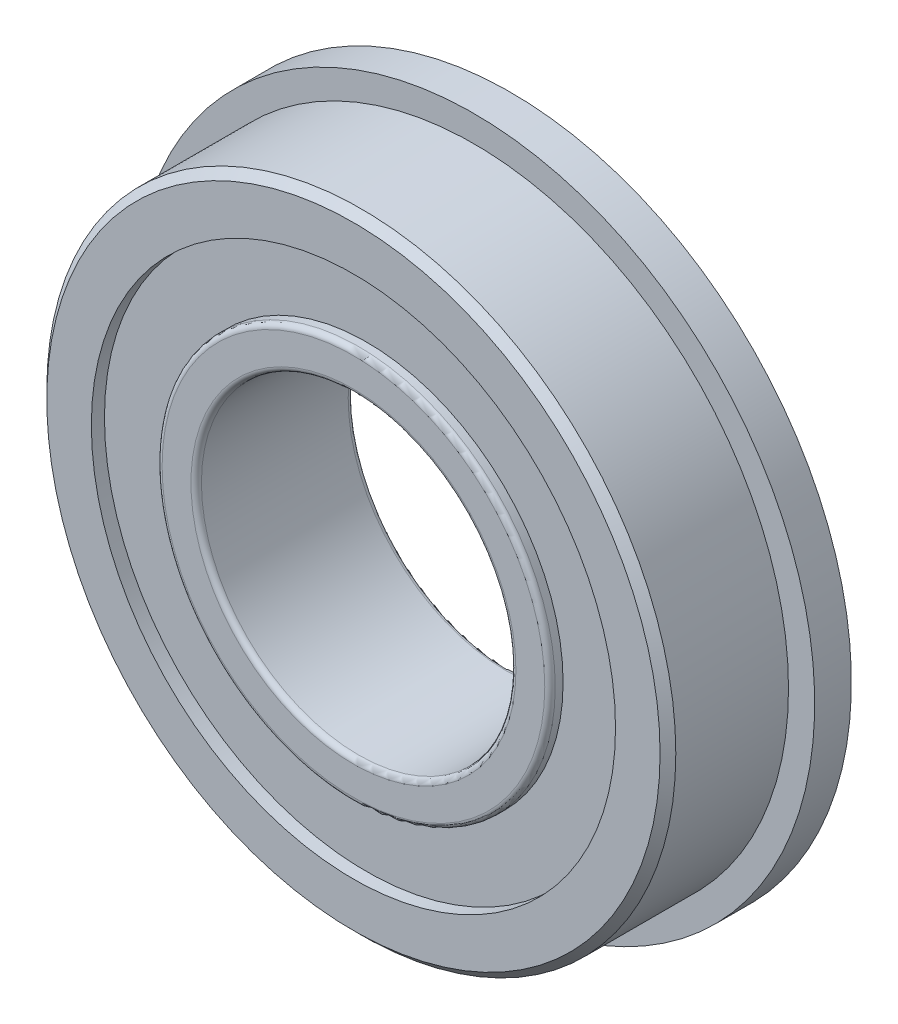
ISO-10303-21;
HEADER;
FILE_DESCRIPTION(('STEP AP214'),'2;1');
FILE_NAME('part.step','',(''),(''),'','','');
FILE_SCHEMA(('AUTOMOTIVE_DESIGN { 1 0 10303 214 1 1 1 1 }'));
ENDSEC;
DATA;
#1=APPLICATION_CONTEXT('core data for automotive mechanical design processes');
#2=APPLICATION_PROTOCOL_DEFINITION('international standard','automotive_design',2000,#1);
#3=PRODUCT_CONTEXT('',#1,'mechanical');
#4=PRODUCT('Part','Part','',(#3));
#5=PRODUCT_RELATED_PRODUCT_CATEGORY('part','',(#4));
#6=PRODUCT_DEFINITION_FORMATION('','',#4);
#7=PRODUCT_DEFINITION_CONTEXT('part definition',#1,'design');
#8=PRODUCT_DEFINITION('design','',#6,#7);
#9=PRODUCT_DEFINITION_SHAPE('','',#8);
#10=(LENGTH_UNIT() NAMED_UNIT(*) SI_UNIT(.MILLI.,.METRE.));
#11=(NAMED_UNIT(*) PLANE_ANGLE_UNIT() SI_UNIT($,.RADIAN.));
#12=(NAMED_UNIT(*) SI_UNIT($,.STERADIAN.) SOLID_ANGLE_UNIT());
#13=UNCERTAINTY_MEASURE_WITH_UNIT(LENGTH_MEASURE(1.E-05),#10,'distance_accuracy_value','');
#14=(GEOMETRIC_REPRESENTATION_CONTEXT(3) GLOBAL_UNCERTAINTY_ASSIGNED_CONTEXT((#13)) GLOBAL_UNIT_ASSIGNED_CONTEXT((#10,
#11,#12)) REPRESENTATION_CONTEXT('',''));
#15=CARTESIAN_POINT('',(0.,0.,0.));
#16=DIRECTION('',(0.,0.,1.));
#17=DIRECTION('',(1.,0.,0.));
#18=AXIS2_PLACEMENT_3D('',#15,#16,#17);
#19=CARTESIAN_POINT('',(0.,0.,-1.4));
#20=DIRECTION('',(0.,0.,-1.));
#21=DIRECTION('',(-1.,0.,0.));
#22=AXIS2_PLACEMENT_3D('',#19,#20,#21);
#23=PLANE('',#22);
#24=CARTESIAN_POINT('',(0.,0.,-1.4));
#25=DIRECTION('',(0.,0.,-1.));
#26=DIRECTION('',(-1.,0.,0.));
#27=AXIS2_PLACEMENT_3D('',#24,#25,#26);
#28=CIRCLE('',#27,7.3);
#29=CARTESIAN_POINT('',(-7.3,0.,-1.4));
#30=VERTEX_POINT('',#29);
#31=EDGE_CURVE('E56',#30,#30,#28,.T.);
#32=ORIENTED_EDGE('',*,*,#31,.T.);
#33=EDGE_LOOP('',(#32));
#34=FACE_BOUND('',#33,.T.);
#35=CARTESIAN_POINT('',(0.,0.,-1.4));
#36=DIRECTION('',(0.,0.,-1.));
#37=DIRECTION('',(-1.,0.,0.));
#38=AXIS2_PLACEMENT_3D('',#35,#36,#37);
#39=CIRCLE('',#38,6.2);
#40=CARTESIAN_POINT('',(-6.2,0.,-1.4));
#41=VERTEX_POINT('',#40);
#42=EDGE_CURVE('E59',#41,#41,#39,.F.);
#43=ORIENTED_EDGE('',*,*,#42,.T.);
#44=EDGE_LOOP('',(#43));
#45=FACE_BOUND('',#44,.T.);
#46=ADVANCED_FACE('F33',(#34,#45),#23,.T.);
#47=CARTESIAN_POINT('',(0.,0.,4.6));
#48=DIRECTION('',(0.,0.,1.));
#49=DIRECTION('',(1.,0.,0.));
#50=AXIS2_PLACEMENT_3D('',#47,#48,#49);
#51=PLANE('',#50);
#52=CARTESIAN_POINT('',(0.,0.,4.6));
#53=DIRECTION('',(0.,0.,1.));
#54=DIRECTION('',(1.,0.,0.));
#55=AXIS2_PLACEMENT_3D('',#52,#53,#54);
#56=CIRCLE('',#55,7.3);
#57=CARTESIAN_POINT('',(7.3,0.,4.6));
#58=VERTEX_POINT('',#57);
#59=EDGE_CURVE('E40',#58,#58,#56,.T.);
#60=ORIENTED_EDGE('',*,*,#59,.T.);
#61=EDGE_LOOP('',(#60));
#62=FACE_BOUND('',#61,.T.);
#63=CARTESIAN_POINT('',(0.,0.,4.6));
#64=DIRECTION('',(0.,0.,1.));
#65=DIRECTION('',(1.,0.,0.));
#66=AXIS2_PLACEMENT_3D('',#63,#64,#65);
#67=CIRCLE('',#66,6.2);
#68=CARTESIAN_POINT('',(6.2,0.,4.6));
#69=VERTEX_POINT('',#68);
#70=EDGE_CURVE('E44',#69,#69,#67,.F.);
#71=ORIENTED_EDGE('',*,*,#70,.T.);
#72=EDGE_LOOP('',(#71));
#73=FACE_BOUND('',#72,.T.);
#74=ADVANCED_FACE('F134',(#62,#73),#51,.T.);
#75=CARTESIAN_POINT('',(0.,0.,4.6));
#76=DIRECTION('',(0.,0.,1.));
#77=DIRECTION('',(1.,0.,0.));
#78=AXIS2_PLACEMENT_3D('',#75,#76,#77);
#79=CIRCLE('',#78,11.7);
#80=CARTESIAN_POINT('',(11.7,0.,4.6));
#81=VERTEX_POINT('',#80);
#82=EDGE_CURVE('E65',#81,#81,#79,.T.);
#83=ORIENTED_EDGE('',*,*,#82,.T.);
#84=EDGE_LOOP('',(#83));
#85=FACE_BOUND('',#84,.T.);
#86=CARTESIAN_POINT('',(0.,0.,4.6));
#87=DIRECTION('',(0.,0.,1.));
#88=DIRECTION('',(1.,0.,0.));
#89=AXIS2_PLACEMENT_3D('',#86,#87,#88);
#90=CIRCLE('',#89,10.);
#91=CARTESIAN_POINT('',(10.,0.,4.6));
#92=VERTEX_POINT('',#91);
#93=EDGE_CURVE('E78',#92,#92,#90,.T.);
#94=ORIENTED_EDGE('',*,*,#93,.F.);
#95=EDGE_LOOP('',(#94));
#96=FACE_BOUND('',#95,.T.);
#97=ADVANCED_FACE('F139',(#85,#96),#51,.T.);
#98=CARTESIAN_POINT('',(0.,0.,4.6));
#99=DIRECTION('',(0.,0.,-1.));
#100=DIRECTION('',(-1.,0.,0.));
#101=AXIS2_PLACEMENT_3D('',#98,#99,#100);
#102=CYLINDRICAL_SURFACE('',#101,12.);
#103=CARTESIAN_POINT('',(0.,0.,4.30000000000001));
#104=DIRECTION('',(0.,0.,1.));
#105=DIRECTION('',(1.,0.,0.));
#106=AXIS2_PLACEMENT_3D('',#103,#104,#105);
#107=CIRCLE('',#106,12.);
#108=CARTESIAN_POINT('',(12.,0.,4.30000000000001));
#109=VERTEX_POINT('',#108);
#110=EDGE_CURVE('E62',#109,#109,#107,.F.);
#111=ORIENTED_EDGE('',*,*,#110,.T.);
#112=EDGE_LOOP('',(#111));
#113=FACE_BOUND('',#112,.T.);
#114=CARTESIAN_POINT('',(0.,0.,0.));
#115=DIRECTION('',(0.,0.,1.));
#116=DIRECTION('',(1.,0.,0.));
#117=AXIS2_PLACEMENT_3D('',#114,#115,#116);
#118=CIRCLE('',#117,12.);
#119=CARTESIAN_POINT('',(12.,0.,0.));
#120=VERTEX_POINT('',#119);
#121=EDGE_CURVE('E68',#120,#120,#118,.T.);
#122=ORIENTED_EDGE('',*,*,#121,.T.);
#123=EDGE_LOOP('',(#122));
#124=FACE_BOUND('',#123,.T.);
#125=ADVANCED_FACE('F165',(#113,#124),#102,.T.);
#126=CARTESIAN_POINT('',(0.,0.,4.6));
#127=DIRECTION('',(0.,0.,-1.));
#128=DIRECTION('',(-1.,0.,0.));
#129=AXIS2_PLACEMENT_3D('',#126,#127,#128);
#130=CYLINDRICAL_SURFACE('',#129,6.);
#131=CARTESIAN_POINT('',(0.,0.,-1.2));
#132=DIRECTION('',(0.,0.,-1.));
#133=DIRECTION('',(-1.,0.,0.));
#134=AXIS2_PLACEMENT_3D('',#131,#132,#133);
#135=CIRCLE('',#134,6.);
#136=CARTESIAN_POINT('',(-6.,0.,-1.2));
#137=VERTEX_POINT('',#136);
#138=EDGE_CURVE('E48',#137,#137,#135,.T.);
#139=ORIENTED_EDGE('',*,*,#138,.T.);
#140=EDGE_LOOP('',(#139));
#141=FACE_BOUND('',#140,.T.);
#142=CARTESIAN_POINT('',(0.,0.,4.4));
#143=DIRECTION('',(0.,0.,1.));
#144=DIRECTION('',(1.,0.,0.));
#145=AXIS2_PLACEMENT_3D('',#142,#143,#144);
#146=CIRCLE('',#145,6.);
#147=CARTESIAN_POINT('',(6.,0.,4.4));
#148=VERTEX_POINT('',#147);
#149=EDGE_CURVE('E53',#148,#148,#146,.T.);
#150=ORIENTED_EDGE('',*,*,#149,.T.);
#151=EDGE_LOOP('',(#150));
#152=FACE_BOUND('',#151,.T.);
#153=ADVANCED_FACE('F116',(#141,#152),#130,.F.);
#154=CARTESIAN_POINT('',(0.,0.,-1.4));
#155=DIRECTION('',(0.,0.,-1.));
#156=DIRECTION('',(-1.,0.,0.));
#157=AXIS2_PLACEMENT_3D('',#154,#155,#156);
#158=CIRCLE('',#157,10.);
#159=CARTESIAN_POINT('',(-10.,0.,-1.4));
#160=VERTEX_POINT('',#159);
#161=EDGE_CURVE('E87',#160,#160,#158,.T.);
#162=ORIENTED_EDGE('',*,*,#161,.F.);
#163=EDGE_LOOP('',(#162));
#164=FACE_BOUND('',#163,.T.);
#165=CARTESIAN_POINT('',(0.,0.,-1.4));
#166=DIRECTION('',(0.,0.,-1.));
#167=DIRECTION('',(-1.,0.,0.));
#168=AXIS2_PLACEMENT_3D('',#165,#166,#167);
#169=CIRCLE('',#168,13.);
#170=CARTESIAN_POINT('',(-13.,0.,-1.4));
#171=VERTEX_POINT('',#170);
#172=EDGE_CURVE('E71',#171,#171,#169,.T.);
#173=ORIENTED_EDGE('',*,*,#172,.T.);
#174=EDGE_LOOP('',(#173));
#175=FACE_BOUND('',#174,.T.);
#176=ADVANCED_FACE('F112',(#164,#175),#23,.T.);
#177=CARTESIAN_POINT('',(0.,0.,0.));
#178=DIRECTION('',(0.,0.,-1.));
#179=DIRECTION('',(-1.,0.,0.));
#180=AXIS2_PLACEMENT_3D('',#177,#178,#179);
#181=PLANE('',#180);
#182=ORIENTED_EDGE('',*,*,#121,.F.);
#183=EDGE_LOOP('',(#182));
#184=FACE_BOUND('',#183,.T.);
#185=CARTESIAN_POINT('',(0.,0.,0.));
#186=DIRECTION('',(0.,0.,-1.));
#187=DIRECTION('',(-1.,0.,0.));
#188=AXIS2_PLACEMENT_3D('',#185,#186,#187);
#189=CIRCLE('',#188,13.);
#190=CARTESIAN_POINT('',(-13.,0.,0.));
#191=VERTEX_POINT('',#190);
#192=EDGE_CURVE('E72',#191,#191,#189,.T.);
#193=ORIENTED_EDGE('',*,*,#192,.F.);
#194=EDGE_LOOP('',(#193));
#195=FACE_BOUND('',#194,.T.);
#196=ADVANCED_FACE('F115',(#184,#195),#181,.F.);
#197=CARTESIAN_POINT('',(0.,0.,-1.4));
#198=DIRECTION('',(0.,0.,1.));
#199=DIRECTION('',(1.,0.,0.));
#200=AXIS2_PLACEMENT_3D('',#197,#198,#199);
#201=CYLINDRICAL_SURFACE('',#200,13.);
#202=ORIENTED_EDGE('',*,*,#172,.F.);
#203=EDGE_LOOP('',(#202));
#204=FACE_BOUND('',#203,.T.);
#205=ORIENTED_EDGE('',*,*,#192,.T.);
#206=EDGE_LOOP('',(#205));
#207=FACE_BOUND('',#206,.T.);
#208=ADVANCED_FACE('F120',(#204,#207),#201,.T.);
#209=CARTESIAN_POINT('',(0.,0.,4.1));
#210=DIRECTION('',(0.,0.,1.));
#211=DIRECTION('',(1.,0.,0.));
#212=AXIS2_PLACEMENT_3D('',#209,#210,#211);
#213=CYLINDRICAL_SURFACE('',#212,10.);
#214=CARTESIAN_POINT('',(0.,0.,4.1));
#215=DIRECTION('',(0.,0.,1.));
#216=DIRECTION('',(1.,0.,0.));
#217=AXIS2_PLACEMENT_3D('',#214,#215,#216);
#218=CIRCLE('',#217,10.);
#219=CARTESIAN_POINT('',(10.,0.,4.1));
#220=VERTEX_POINT('',#219);
#221=EDGE_CURVE('E75',#220,#220,#218,.T.);
#222=ORIENTED_EDGE('',*,*,#221,.F.);
#223=EDGE_LOOP('',(#222));
#224=FACE_BOUND('',#223,.T.);
#225=ORIENTED_EDGE('',*,*,#93,.T.);
#226=EDGE_LOOP('',(#225));
#227=FACE_BOUND('',#226,.T.);
#228=ADVANCED_FACE('F123',(#224,#227),#213,.F.);
#229=CARTESIAN_POINT('',(0.,0.,4.1));
#230=DIRECTION('',(0.,0.,1.));
#231=DIRECTION('',(1.,0.,0.));
#232=AXIS2_PLACEMENT_3D('',#229,#230,#231);
#233=PLANE('',#232);
#234=CARTESIAN_POINT('',(0.,0.,4.1));
#235=DIRECTION('',(0.,0.,1.));
#236=DIRECTION('',(1.,0.,0.));
#237=AXIS2_PLACEMENT_3D('',#234,#235,#236);
#238=CIRCLE('',#237,7.5);
#239=CARTESIAN_POINT('',(7.5,0.,4.1));
#240=VERTEX_POINT('',#239);
#241=EDGE_CURVE('E81',#240,#240,#238,.T.);
#242=ORIENTED_EDGE('',*,*,#241,.F.);
#243=EDGE_LOOP('',(#242));
#244=FACE_BOUND('',#243,.T.);
#245=ORIENTED_EDGE('',*,*,#221,.T.);
#246=EDGE_LOOP('',(#245));
#247=FACE_BOUND('',#246,.T.);
#248=ADVANCED_FACE('F145',(#244,#247),#233,.T.);
#249=CARTESIAN_POINT('',(0.,0.,4.1));
#250=DIRECTION('',(0.,0.,1.));
#251=DIRECTION('',(1.,0.,0.));
#252=AXIS2_PLACEMENT_3D('',#249,#250,#251);
#253=CYLINDRICAL_SURFACE('',#252,7.5);
#254=CARTESIAN_POINT('',(0.,0.,4.4));
#255=DIRECTION('',(0.,0.,1.));
#256=DIRECTION('',(1.,0.,0.));
#257=AXIS2_PLACEMENT_3D('',#254,#255,#256);
#258=CIRCLE('',#257,7.5);
#259=CARTESIAN_POINT('',(7.5,0.,4.4));
#260=VERTEX_POINT('',#259);
#261=EDGE_CURVE('E10',#260,#260,#258,.F.);
#262=ORIENTED_EDGE('',*,*,#261,.T.);
#263=EDGE_LOOP('',(#262));
#264=FACE_BOUND('',#263,.T.);
#265=ORIENTED_EDGE('',*,*,#241,.T.);
#266=EDGE_LOOP('',(#265));
#267=FACE_BOUND('',#266,.T.);
#268=ADVANCED_FACE('F149',(#264,#267),#253,.T.);
#269=CARTESIAN_POINT('',(0.,0.,4.6));
#270=DIRECTION('',(0.,0.,-1.));
#271=DIRECTION('',(-1.,0.,0.));
#272=AXIS2_PLACEMENT_3D('',#269,#270,#271);
#273=CONICAL_SURFACE('',#272,11.7,0.785398163397445);
#274=ORIENTED_EDGE('',*,*,#110,.F.);
#275=EDGE_LOOP('',(#274));
#276=FACE_BOUND('',#275,.T.);
#277=ORIENTED_EDGE('',*,*,#82,.F.);
#278=EDGE_LOOP('',(#277));
#279=FACE_BOUND('',#278,.T.);
#280=ADVANCED_FACE('F108',(#276,#279),#273,.T.);
#281=CARTESIAN_POINT('',(0.,0.,-1.2));
#282=DIRECTION('',(0.,0.,-1.));
#283=DIRECTION('',(-1.,0.,0.));
#284=AXIS2_PLACEMENT_3D('',#281,#282,#283);
#285=CYLINDRICAL_SURFACE('',#284,10.);
#286=CARTESIAN_POINT('',(0.,0.,-1.2));
#287=DIRECTION('',(0.,0.,-1.));
#288=DIRECTION('',(-1.,0.,0.));
#289=AXIS2_PLACEMENT_3D('',#286,#287,#288);
#290=CIRCLE('',#289,10.);
#291=CARTESIAN_POINT('',(-10.,0.,-1.2));
#292=VERTEX_POINT('',#291);
#293=EDGE_CURVE('E86',#292,#292,#290,.T.);
#294=ORIENTED_EDGE('',*,*,#293,.F.);
#295=EDGE_LOOP('',(#294));
#296=FACE_BOUND('',#295,.T.);
#297=ORIENTED_EDGE('',*,*,#161,.T.);
#298=EDGE_LOOP('',(#297));
#299=FACE_BOUND('',#298,.T.);
#300=ADVANCED_FACE('F102',(#296,#299),#285,.F.);
#301=CARTESIAN_POINT('',(0.,0.,-1.2));
#302=DIRECTION('',(0.,0.,-1.));
#303=DIRECTION('',(-1.,0.,0.));
#304=AXIS2_PLACEMENT_3D('',#301,#302,#303);
#305=PLANE('',#304);
#306=CARTESIAN_POINT('',(0.,0.,-1.2));
#307=DIRECTION('',(0.,0.,-1.));
#308=DIRECTION('',(-1.,0.,0.));
#309=AXIS2_PLACEMENT_3D('',#306,#307,#308);
#310=CIRCLE('',#309,7.5);
#311=CARTESIAN_POINT('',(-7.5,0.,-1.2));
#312=VERTEX_POINT('',#311);
#313=EDGE_CURVE('E90',#312,#312,#310,.T.);
#314=ORIENTED_EDGE('',*,*,#313,.F.);
#315=EDGE_LOOP('',(#314));
#316=FACE_BOUND('',#315,.T.);
#317=ORIENTED_EDGE('',*,*,#293,.T.);
#318=EDGE_LOOP('',(#317));
#319=FACE_BOUND('',#318,.T.);
#320=ADVANCED_FACE('F99',(#316,#319),#305,.T.);
#321=CARTESIAN_POINT('',(0.,0.,-1.2));
#322=DIRECTION('',(0.,0.,-1.));
#323=DIRECTION('',(-1.,0.,0.));
#324=AXIS2_PLACEMENT_3D('',#321,#322,#323);
#325=TOROIDAL_SURFACE('',#324,7.3,0.2);
#326=ORIENTED_EDGE('',*,*,#313,.T.);
#327=EDGE_LOOP('',(#326));
#328=FACE_BOUND('',#327,.T.);
#329=ORIENTED_EDGE('',*,*,#31,.F.);
#330=EDGE_LOOP('',(#329));
#331=FACE_BOUND('',#330,.T.);
#332=ADVANCED_FACE('F96',(#328,#331),#325,.T.);
#333=CARTESIAN_POINT('',(0.,0.,-1.2));
#334=DIRECTION('',(0.,0.,-1.));
#335=DIRECTION('',(-1.,0.,0.));
#336=AXIS2_PLACEMENT_3D('',#333,#334,#335);
#337=TOROIDAL_SURFACE('',#336,6.2,0.2);
#338=ORIENTED_EDGE('',*,*,#42,.F.);
#339=EDGE_LOOP('',(#338));
#340=FACE_BOUND('',#339,.T.);
#341=ORIENTED_EDGE('',*,*,#138,.F.);
#342=EDGE_LOOP('',(#341));
#343=FACE_BOUND('',#342,.T.);
#344=ADVANCED_FACE('F179',(#340,#343),#337,.T.);
#345=CARTESIAN_POINT('',(0.,0.,4.4));
#346=DIRECTION('',(0.,0.,1.));
#347=DIRECTION('',(1.,0.,0.));
#348=AXIS2_PLACEMENT_3D('',#345,#346,#347);
#349=TOROIDAL_SURFACE('',#348,7.3,0.2);
#350=ORIENTED_EDGE('',*,*,#261,.F.);
#351=EDGE_LOOP('',(#350));
#352=FACE_BOUND('',#351,.T.);
#353=ORIENTED_EDGE('',*,*,#59,.F.);
#354=EDGE_LOOP('',(#353));
#355=FACE_BOUND('',#354,.T.);
#356=ADVANCED_FACE('F181',(#352,#355),#349,.T.);
#357=CARTESIAN_POINT('',(0.,0.,4.4));
#358=DIRECTION('',(0.,0.,1.));
#359=DIRECTION('',(1.,0.,0.));
#360=AXIS2_PLACEMENT_3D('',#357,#358,#359);
#361=TOROIDAL_SURFACE('',#360,6.2,0.2);
#362=ORIENTED_EDGE('',*,*,#70,.F.);
#363=EDGE_LOOP('',(#362));
#364=FACE_BOUND('',#363,.T.);
#365=ORIENTED_EDGE('',*,*,#149,.F.);
#366=EDGE_LOOP('',(#365));
#367=FACE_BOUND('',#366,.T.);
#368=ADVANCED_FACE('F35',(#364,#367),#361,.T.);
#369=CLOSED_SHELL('',(#46,#74,#97,#125,#153,#176,#196,#208,#228,#248,#268,#280,#300,#320,#332,
#344,#356,#368));
#370=MANIFOLD_SOLID_BREP('B2',#369);
#371=ADVANCED_BREP_SHAPE_REPRESENTATION('',(#18,#370),#14);
#372=SHAPE_DEFINITION_REPRESENTATION(#9,#371);
ENDSEC;
END-ISO-10303-21;
